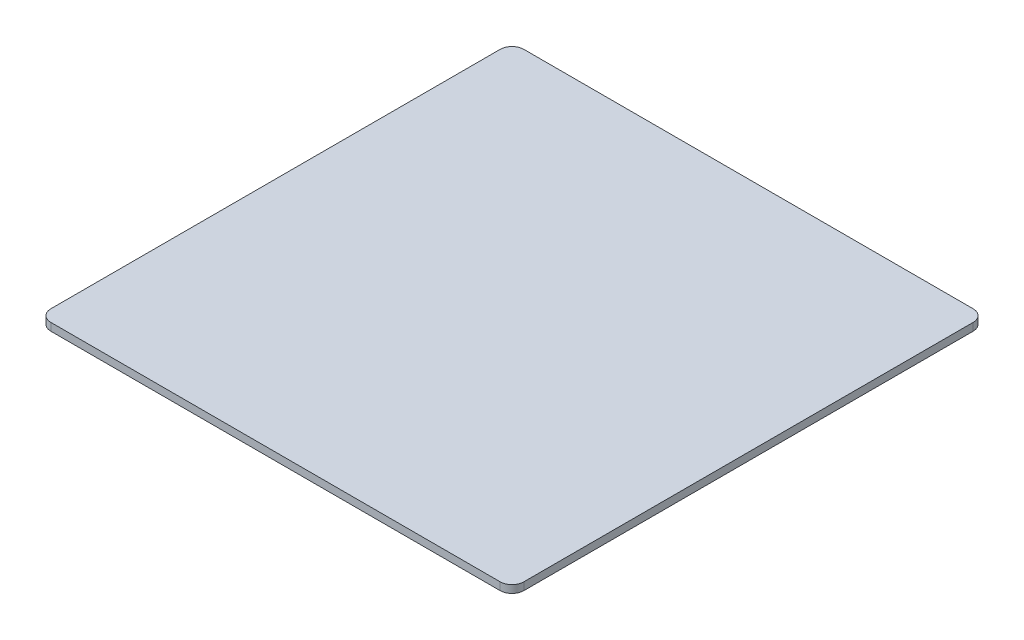
ISO-10303-21;
HEADER;
FILE_DESCRIPTION(('STEP AP214'),'2;1');
FILE_NAME('part.step','',(''),(''),'','','');
FILE_SCHEMA(('AUTOMOTIVE_DESIGN { 1 0 10303 214 1 1 1 1 }'));
ENDSEC;
DATA;
#1=APPLICATION_CONTEXT('core data for automotive mechanical design processes');
#2=APPLICATION_PROTOCOL_DEFINITION('international standard','automotive_design',2000,#1);
#3=PRODUCT_CONTEXT('',#1,'mechanical');
#4=PRODUCT('Part','Part','',(#3));
#5=PRODUCT_RELATED_PRODUCT_CATEGORY('part','',(#4));
#6=PRODUCT_DEFINITION_FORMATION('','',#4);
#7=PRODUCT_DEFINITION_CONTEXT('part definition',#1,'design');
#8=PRODUCT_DEFINITION('design','',#6,#7);
#9=PRODUCT_DEFINITION_SHAPE('','',#8);
#10=(LENGTH_UNIT() NAMED_UNIT(*) SI_UNIT(.MILLI.,.METRE.));
#11=(NAMED_UNIT(*) PLANE_ANGLE_UNIT() SI_UNIT($,.RADIAN.));
#12=(NAMED_UNIT(*) SI_UNIT($,.STERADIAN.) SOLID_ANGLE_UNIT());
#13=UNCERTAINTY_MEASURE_WITH_UNIT(LENGTH_MEASURE(1.E-05),#10,'distance_accuracy_value','');
#14=(GEOMETRIC_REPRESENTATION_CONTEXT(3) GLOBAL_UNCERTAINTY_ASSIGNED_CONTEXT((#13)) GLOBAL_UNIT_ASSIGNED_CONTEXT((#10,
#11,#12)) REPRESENTATION_CONTEXT('',''));
#15=CARTESIAN_POINT('',(0.,0.,0.));
#16=DIRECTION('',(0.,0.,1.));
#17=DIRECTION('',(1.,0.,0.));
#18=AXIS2_PLACEMENT_3D('',#15,#16,#17);
#19=CARTESIAN_POINT('',(0.,3.302,0.));
#20=DIRECTION('',(-1.,0.,0.));
#21=DIRECTION('',(0.,0.,1.));
#22=AXIS2_PLACEMENT_3D('',#19,#20,#21);
#23=PLANE('',#22);
#24=DIRECTION('',(0.,0.,-1.));
#25=VECTOR('',#24,1.);
#26=CARTESIAN_POINT('',(0.,0.,0.));
#27=LINE('',#26,#25);
#28=CARTESIAN_POINT('',(0.,0.,-5.08));
#29=VERTEX_POINT('',#28);
#30=CARTESIAN_POINT('',(0.,0.,-198.12));
#31=VERTEX_POINT('',#30);
#32=EDGE_CURVE('E167',#29,#31,#27,.T.);
#33=ORIENTED_EDGE('',*,*,#32,.T.);
#34=DIRECTION('',(0.,-1.,0.));
#35=VECTOR('',#34,1.);
#36=CARTESIAN_POINT('',(0.,3.302,-198.12));
#37=LINE('',#36,#35);
#38=CARTESIAN_POINT('',(0.,3.302,-198.12));
#39=VERTEX_POINT('',#38);
#40=EDGE_CURVE('E145',#31,#39,#37,.F.);
#41=ORIENTED_EDGE('',*,*,#40,.T.);
#42=DIRECTION('',(0.,0.,-1.));
#43=VECTOR('',#42,1.);
#44=CARTESIAN_POINT('',(0.,3.302,0.));
#45=LINE('',#44,#43);
#46=CARTESIAN_POINT('',(0.,3.302,-5.08));
#47=VERTEX_POINT('',#46);
#48=EDGE_CURVE('E119',#47,#39,#45,.T.);
#49=ORIENTED_EDGE('',*,*,#48,.F.);
#50=DIRECTION('',(0.,-1.,0.));
#51=VECTOR('',#50,1.);
#52=CARTESIAN_POINT('',(0.,3.302,-5.08));
#53=LINE('',#52,#51);
#54=EDGE_CURVE('E132',#47,#29,#53,.T.);
#55=ORIENTED_EDGE('',*,*,#54,.T.);
#56=EDGE_LOOP('',(#33,#41,#49,#55));
#57=FACE_BOUND('',#56,.T.);
#58=ADVANCED_FACE('F32',(#57),#23,.F.);
#59=CARTESIAN_POINT('',(0.,3.302,-203.2));
#60=DIRECTION('',(0.,0.,1.));
#61=DIRECTION('',(1.,0.,0.));
#62=AXIS2_PLACEMENT_3D('',#59,#60,#61);
#63=PLANE('',#62);
#64=DIRECTION('',(-1.,0.,0.));
#65=VECTOR('',#64,1.);
#66=CARTESIAN_POINT('',(0.,0.,-203.2));
#67=LINE('',#66,#65);
#68=CARTESIAN_POINT('',(-5.08,0.,-203.2));
#69=VERTEX_POINT('',#68);
#70=CARTESIAN_POINT('',(-198.12,0.,-203.2));
#71=VERTEX_POINT('',#70);
#72=EDGE_CURVE('E125',#69,#71,#67,.T.);
#73=ORIENTED_EDGE('',*,*,#72,.T.);
#74=DIRECTION('',(0.,-1.,0.));
#75=VECTOR('',#74,1.);
#76=CARTESIAN_POINT('',(-198.12,3.302,-203.2));
#77=LINE('',#76,#75);
#78=CARTESIAN_POINT('',(-198.12,3.302,-203.2));
#79=VERTEX_POINT('',#78);
#80=EDGE_CURVE('E40',#71,#79,#77,.F.);
#81=ORIENTED_EDGE('',*,*,#80,.T.);
#82=DIRECTION('',(-1.,0.,0.));
#83=VECTOR('',#82,1.);
#84=CARTESIAN_POINT('',(0.,3.302,-203.2));
#85=LINE('',#84,#83);
#86=CARTESIAN_POINT('',(-5.08,3.302,-203.2));
#87=VERTEX_POINT('',#86);
#88=EDGE_CURVE('E123',#87,#79,#85,.T.);
#89=ORIENTED_EDGE('',*,*,#88,.F.);
#90=DIRECTION('',(0.,-1.,0.));
#91=VECTOR('',#90,1.);
#92=CARTESIAN_POINT('',(-5.08,3.302,-203.2));
#93=LINE('',#92,#91);
#94=EDGE_CURVE('E140',#87,#69,#93,.T.);
#95=ORIENTED_EDGE('',*,*,#94,.T.);
#96=EDGE_LOOP('',(#73,#81,#89,#95));
#97=FACE_BOUND('',#96,.T.);
#98=ADVANCED_FACE('F169',(#97),#63,.F.);
#99=CARTESIAN_POINT('',(-203.2,3.302,0.));
#100=DIRECTION('',(1.,0.,0.));
#101=DIRECTION('',(0.,0.,-1.));
#102=AXIS2_PLACEMENT_3D('',#99,#100,#101);
#103=PLANE('',#102);
#104=DIRECTION('',(0.,0.,1.));
#105=VECTOR('',#104,1.);
#106=CARTESIAN_POINT('',(-203.2,3.302,0.));
#107=LINE('',#106,#105);
#108=CARTESIAN_POINT('',(-203.2,3.302,-198.12));
#109=VERTEX_POINT('',#108);
#110=CARTESIAN_POINT('',(-203.2,3.302,-5.08));
#111=VERTEX_POINT('',#110);
#112=EDGE_CURVE('E156',#109,#111,#107,.T.);
#113=ORIENTED_EDGE('',*,*,#112,.F.);
#114=DIRECTION('',(0.,-1.,0.));
#115=VECTOR('',#114,1.);
#116=CARTESIAN_POINT('',(-203.2,3.302,-198.12));
#117=LINE('',#116,#115);
#118=CARTESIAN_POINT('',(-203.2,0.,-198.12));
#119=VERTEX_POINT('',#118);
#120=EDGE_CURVE('E149',#109,#119,#117,.T.);
#121=ORIENTED_EDGE('',*,*,#120,.T.);
#122=DIRECTION('',(0.,0.,1.));
#123=VECTOR('',#122,1.);
#124=CARTESIAN_POINT('',(-203.2,0.,0.));
#125=LINE('',#124,#123);
#126=CARTESIAN_POINT('',(-203.2,0.,-5.08));
#127=VERTEX_POINT('',#126);
#128=EDGE_CURVE('E120',#119,#127,#125,.T.);
#129=ORIENTED_EDGE('',*,*,#128,.T.);
#130=DIRECTION('',(0.,-1.,0.));
#131=VECTOR('',#130,1.);
#132=CARTESIAN_POINT('',(-203.2,3.302,-5.08));
#133=LINE('',#132,#131);
#134=EDGE_CURVE('E104',#127,#111,#133,.F.);
#135=ORIENTED_EDGE('',*,*,#134,.T.);
#136=EDGE_LOOP('',(#113,#121,#129,#135));
#137=FACE_BOUND('',#136,.T.);
#138=ADVANCED_FACE('F155',(#137),#103,.F.);
#139=CARTESIAN_POINT('',(0.,3.302,0.));
#140=DIRECTION('',(0.,0.,-1.));
#141=DIRECTION('',(-1.,0.,0.));
#142=AXIS2_PLACEMENT_3D('',#139,#140,#141);
#143=PLANE('',#142);
#144=DIRECTION('',(1.,0.,0.));
#145=VECTOR('',#144,1.);
#146=CARTESIAN_POINT('',(0.,0.,0.));
#147=LINE('',#146,#145);
#148=CARTESIAN_POINT('',(-198.12,0.,0.));
#149=VERTEX_POINT('',#148);
#150=CARTESIAN_POINT('',(-5.08,0.,0.));
#151=VERTEX_POINT('',#150);
#152=EDGE_CURVE('E111',#149,#151,#147,.T.);
#153=ORIENTED_EDGE('',*,*,#152,.T.);
#154=DIRECTION('',(0.,-1.,0.));
#155=VECTOR('',#154,1.);
#156=CARTESIAN_POINT('',(-5.08,3.302,0.));
#157=LINE('',#156,#155);
#158=CARTESIAN_POINT('',(-5.08,3.302,0.));
#159=VERTEX_POINT('',#158);
#160=EDGE_CURVE('E136',#151,#159,#157,.F.);
#161=ORIENTED_EDGE('',*,*,#160,.T.);
#162=DIRECTION('',(1.,0.,0.));
#163=VECTOR('',#162,1.);
#164=CARTESIAN_POINT('',(0.,3.302,0.));
#165=LINE('',#164,#163);
#166=CARTESIAN_POINT('',(-198.12,3.302,0.));
#167=VERTEX_POINT('',#166);
#168=EDGE_CURVE('E114',#167,#159,#165,.T.);
#169=ORIENTED_EDGE('',*,*,#168,.F.);
#170=DIRECTION('',(0.,-1.,0.));
#171=VECTOR('',#170,1.);
#172=CARTESIAN_POINT('',(-198.12,3.302,0.));
#173=LINE('',#172,#171);
#174=EDGE_CURVE('E102',#167,#149,#173,.T.);
#175=ORIENTED_EDGE('',*,*,#174,.T.);
#176=EDGE_LOOP('',(#153,#161,#169,#175));
#177=FACE_BOUND('',#176,.T.);
#178=ADVANCED_FACE('F110',(#177),#143,.F.);
#179=CARTESIAN_POINT('',(0.,3.302,0.));
#180=DIRECTION('',(0.,1.,0.));
#181=DIRECTION('',(0.,0.,1.));
#182=AXIS2_PLACEMENT_3D('',#179,#180,#181);
#183=PLANE('',#182);
#184=ORIENTED_EDGE('',*,*,#88,.T.);
#185=CARTESIAN_POINT('',(-198.12,3.302,-198.12));
#186=DIRECTION('',(0.,1.,0.));
#187=DIRECTION('',(0.,0.,1.));
#188=AXIS2_PLACEMENT_3D('',#185,#186,#187);
#189=CIRCLE('',#188,5.08);
#190=EDGE_CURVE('E11',#79,#109,#189,.T.);
#191=ORIENTED_EDGE('',*,*,#190,.T.);
#192=ORIENTED_EDGE('',*,*,#112,.T.);
#193=CARTESIAN_POINT('',(-198.12,3.302,-5.08));
#194=DIRECTION('',(0.,1.,0.));
#195=DIRECTION('',(0.,0.,1.));
#196=AXIS2_PLACEMENT_3D('',#193,#194,#195);
#197=CIRCLE('',#196,5.08);
#198=EDGE_CURVE('E130',#111,#167,#197,.T.);
#199=ORIENTED_EDGE('',*,*,#198,.T.);
#200=ORIENTED_EDGE('',*,*,#168,.T.);
#201=CARTESIAN_POINT('',(-5.08,3.302,-5.08));
#202=DIRECTION('',(0.,1.,0.));
#203=DIRECTION('',(0.,0.,1.));
#204=AXIS2_PLACEMENT_3D('',#201,#202,#203);
#205=CIRCLE('',#204,5.08);
#206=EDGE_CURVE('E138',#159,#47,#205,.T.);
#207=ORIENTED_EDGE('',*,*,#206,.T.);
#208=ORIENTED_EDGE('',*,*,#48,.T.);
#209=CARTESIAN_POINT('',(-5.08,3.302,-198.12));
#210=DIRECTION('',(0.,1.,0.));
#211=DIRECTION('',(0.,0.,1.));
#212=AXIS2_PLACEMENT_3D('',#209,#210,#211);
#213=CIRCLE('',#212,5.08);
#214=EDGE_CURVE('E147',#39,#87,#213,.T.);
#215=ORIENTED_EDGE('',*,*,#214,.T.);
#216=EDGE_LOOP('',(#184,#191,#192,#199,#200,#207,#208,#215));
#217=FACE_BOUND('',#216,.T.);
#218=ADVANCED_FACE('F160',(#217),#183,.T.);
#219=CARTESIAN_POINT('',(0.,0.,0.));
#220=DIRECTION('',(0.,1.,0.));
#221=DIRECTION('',(0.,0.,1.));
#222=AXIS2_PLACEMENT_3D('',#219,#220,#221);
#223=PLANE('',#222);
#224=ORIENTED_EDGE('',*,*,#128,.F.);
#225=CARTESIAN_POINT('',(-198.12,0.,-198.12));
#226=DIRECTION('',(0.,1.,0.));
#227=DIRECTION('',(0.,0.,1.));
#228=AXIS2_PLACEMENT_3D('',#225,#226,#227);
#229=CIRCLE('',#228,5.08);
#230=EDGE_CURVE('E54',#119,#71,#229,.F.);
#231=ORIENTED_EDGE('',*,*,#230,.T.);
#232=ORIENTED_EDGE('',*,*,#72,.F.);
#233=CARTESIAN_POINT('',(-5.08,0.,-198.12));
#234=DIRECTION('',(0.,1.,0.));
#235=DIRECTION('',(0.,0.,1.));
#236=AXIS2_PLACEMENT_3D('',#233,#234,#235);
#237=CIRCLE('',#236,5.08);
#238=EDGE_CURVE('E143',#69,#31,#237,.F.);
#239=ORIENTED_EDGE('',*,*,#238,.T.);
#240=ORIENTED_EDGE('',*,*,#32,.F.);
#241=CARTESIAN_POINT('',(-5.08,0.,-5.08));
#242=DIRECTION('',(0.,1.,0.));
#243=DIRECTION('',(0.,0.,1.));
#244=AXIS2_PLACEMENT_3D('',#241,#242,#243);
#245=CIRCLE('',#244,5.08);
#246=EDGE_CURVE('E118',#29,#151,#245,.F.);
#247=ORIENTED_EDGE('',*,*,#246,.T.);
#248=ORIENTED_EDGE('',*,*,#152,.F.);
#249=CARTESIAN_POINT('',(-198.12,0.,-5.08));
#250=DIRECTION('',(0.,1.,0.));
#251=DIRECTION('',(0.,0.,1.));
#252=AXIS2_PLACEMENT_3D('',#249,#250,#251);
#253=CIRCLE('',#252,5.08);
#254=EDGE_CURVE('E98',#149,#127,#253,.F.);
#255=ORIENTED_EDGE('',*,*,#254,.T.);
#256=EDGE_LOOP('',(#224,#231,#232,#239,#240,#247,#248,#255));
#257=FACE_BOUND('',#256,.T.);
#258=ADVANCED_FACE('F116',(#257),#223,.F.);
#259=CARTESIAN_POINT('',(-198.12,3.302,-5.08));
#260=DIRECTION('',(0.,-1.,0.));
#261=DIRECTION('',(0.,0.,-1.));
#262=AXIS2_PLACEMENT_3D('',#259,#260,#261);
#263=CYLINDRICAL_SURFACE('',#262,5.08);
#264=ORIENTED_EDGE('',*,*,#198,.F.);
#265=ORIENTED_EDGE('',*,*,#134,.F.);
#266=ORIENTED_EDGE('',*,*,#254,.F.);
#267=ORIENTED_EDGE('',*,*,#174,.F.);
#268=EDGE_LOOP('',(#264,#265,#266,#267));
#269=FACE_BOUND('',#268,.T.);
#270=ADVANCED_FACE('F101',(#269),#263,.T.);
#271=CARTESIAN_POINT('',(-5.08,3.302,-5.08));
#272=DIRECTION('',(0.,-1.,0.));
#273=DIRECTION('',(0.,0.,-1.));
#274=AXIS2_PLACEMENT_3D('',#271,#272,#273);
#275=CYLINDRICAL_SURFACE('',#274,5.08);
#276=ORIENTED_EDGE('',*,*,#206,.F.);
#277=ORIENTED_EDGE('',*,*,#160,.F.);
#278=ORIENTED_EDGE('',*,*,#246,.F.);
#279=ORIENTED_EDGE('',*,*,#54,.F.);
#280=EDGE_LOOP('',(#276,#277,#278,#279));
#281=FACE_BOUND('',#280,.T.);
#282=ADVANCED_FACE('F177',(#281),#275,.T.);
#283=CARTESIAN_POINT('',(-5.08,3.302,-198.12));
#284=DIRECTION('',(0.,-1.,0.));
#285=DIRECTION('',(0.,0.,-1.));
#286=AXIS2_PLACEMENT_3D('',#283,#284,#285);
#287=CYLINDRICAL_SURFACE('',#286,5.08);
#288=ORIENTED_EDGE('',*,*,#214,.F.);
#289=ORIENTED_EDGE('',*,*,#40,.F.);
#290=ORIENTED_EDGE('',*,*,#238,.F.);
#291=ORIENTED_EDGE('',*,*,#94,.F.);
#292=EDGE_LOOP('',(#288,#289,#290,#291));
#293=FACE_BOUND('',#292,.T.);
#294=ADVANCED_FACE('F175',(#293),#287,.T.);
#295=CARTESIAN_POINT('',(-198.12,3.302,-198.12));
#296=DIRECTION('',(0.,-1.,0.));
#297=DIRECTION('',(0.,0.,-1.));
#298=AXIS2_PLACEMENT_3D('',#295,#296,#297);
#299=CYLINDRICAL_SURFACE('',#298,5.08);
#300=ORIENTED_EDGE('',*,*,#190,.F.);
#301=ORIENTED_EDGE('',*,*,#80,.F.);
#302=ORIENTED_EDGE('',*,*,#230,.F.);
#303=ORIENTED_EDGE('',*,*,#120,.F.);
#304=EDGE_LOOP('',(#300,#301,#302,#303));
#305=FACE_BOUND('',#304,.T.);
#306=ADVANCED_FACE('F34',(#305),#299,.T.);
#307=CLOSED_SHELL('',(#58,#98,#138,#178,#218,#258,#270,#282,#294,#306));
#308=MANIFOLD_SOLID_BREP('B2',#307);
#309=ADVANCED_BREP_SHAPE_REPRESENTATION('',(#18,#308),#14);
#310=SHAPE_DEFINITION_REPRESENTATION(#9,#309);
ENDSEC;
END-ISO-10303-21;
